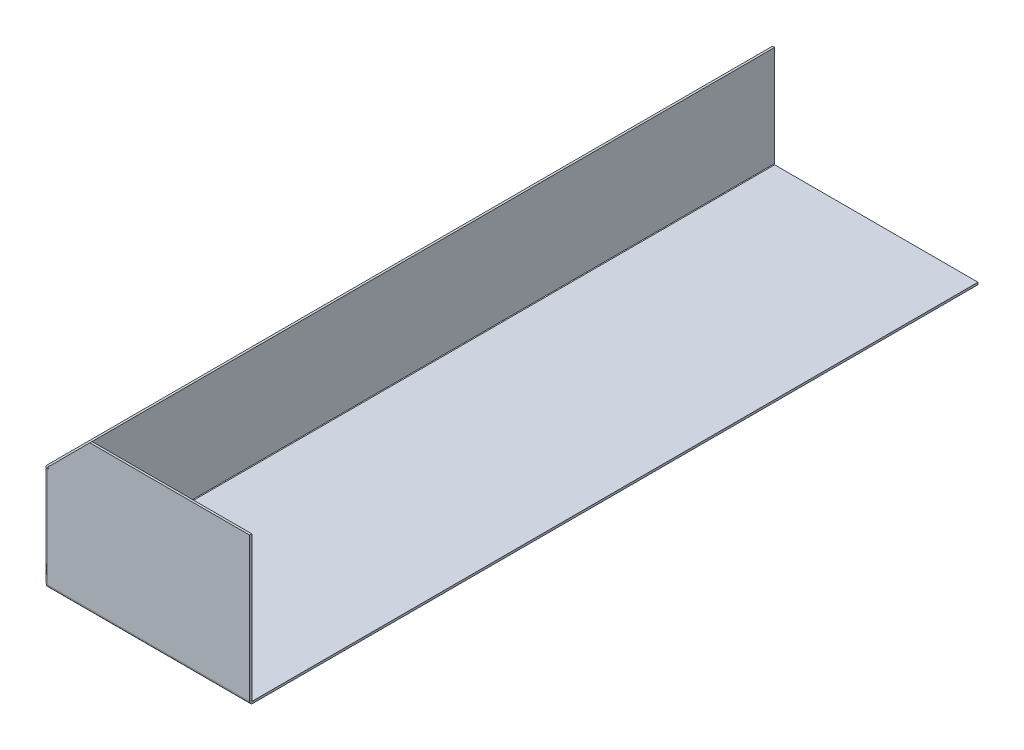
ISO-10303-21;
HEADER;
FILE_DESCRIPTION(('STEP AP214'),'2;1');
FILE_NAME('part.step','',(''),(''),'','','');
FILE_SCHEMA(('AUTOMOTIVE_DESIGN { 1 0 10303 214 1 1 1 1 }'));
ENDSEC;
DATA;
#1=APPLICATION_CONTEXT('core data for automotive mechanical design processes');
#2=APPLICATION_PROTOCOL_DEFINITION('international standard','automotive_design',2000,#1);
#3=PRODUCT_CONTEXT('',#1,'mechanical');
#4=PRODUCT('Part','Part','',(#3));
#5=PRODUCT_RELATED_PRODUCT_CATEGORY('part','',(#4));
#6=PRODUCT_DEFINITION_FORMATION('','',#4);
#7=PRODUCT_DEFINITION_CONTEXT('part definition',#1,'design');
#8=PRODUCT_DEFINITION('design','',#6,#7);
#9=PRODUCT_DEFINITION_SHAPE('','',#8);
#10=(LENGTH_UNIT() NAMED_UNIT(*) SI_UNIT(.MILLI.,.METRE.));
#11=(NAMED_UNIT(*) PLANE_ANGLE_UNIT() SI_UNIT($,.RADIAN.));
#12=(NAMED_UNIT(*) SI_UNIT($,.STERADIAN.) SOLID_ANGLE_UNIT());
#13=UNCERTAINTY_MEASURE_WITH_UNIT(LENGTH_MEASURE(1.E-05),#10,'distance_accuracy_value','');
#14=(GEOMETRIC_REPRESENTATION_CONTEXT(3) GLOBAL_UNCERTAINTY_ASSIGNED_CONTEXT((#13)) GLOBAL_UNIT_ASSIGNED_CONTEXT((#10,
#11,#12)) REPRESENTATION_CONTEXT('',''));
#15=CARTESIAN_POINT('',(0.,0.,0.));
#16=DIRECTION('',(0.,0.,1.));
#17=DIRECTION('',(1.,0.,0.));
#18=AXIS2_PLACEMENT_3D('',#15,#16,#17);
#19=CARTESIAN_POINT('',(-69.2634,-49.2634,-1.5));
#20=DIRECTION('',(0.,1.,0.));
#21=DIRECTION('',(0.,0.,1.));
#22=AXIS2_PLACEMENT_3D('',#19,#20,#21);
#23=PLANE('',#22);
#24=DIRECTION('',(-1.,0.,0.));
#25=VECTOR('',#24,1.);
#26=CARTESIAN_POINT('',(-70.,-49.2634,0.));
#27=LINE('',#26,#25);
#28=CARTESIAN_POINT('',(-70.,-49.2634,0.));
#29=VERTEX_POINT('',#28);
#30=CARTESIAN_POINT('',(-69.2634,-49.2634,0.));
#31=VERTEX_POINT('',#30);
#32=EDGE_CURVE('E265',#29,#31,#27,.F.);
#33=ORIENTED_EDGE('',*,*,#32,.T.);
#34=CARTESIAN_POINT('',(-69.2634,-49.2634,-2.23660000000001));
#35=DIRECTION('',(0.,1.,0.));
#36=DIRECTION('',(0.,0.,1.));
#37=AXIS2_PLACEMENT_3D('',#34,#35,#36);
#38=CIRCLE('',#37,2.2366);
#39=CARTESIAN_POINT('',(-70.,-49.2634,-0.124776143708955));
#40=VERTEX_POINT('',#39);
#41=EDGE_CURVE('E200',#31,#40,#38,.F.);
#42=ORIENTED_EDGE('',*,*,#41,.T.);
#43=DIRECTION('',(0.,0.,1.));
#44=VECTOR('',#43,1.);
#45=CARTESIAN_POINT('',(-70.,-49.2634,-1.50000000000001));
#46=LINE('',#45,#44);
#47=EDGE_CURVE('E271',#40,#29,#46,.T.);
#48=ORIENTED_EDGE('',*,*,#47,.T.);
#49=EDGE_LOOP('',(#33,#42,#48));
#50=FACE_BOUND('',#49,.T.);
#51=ADVANCED_FACE('F37',(#50),#23,.T.);
#52=CARTESIAN_POINT('',(0.,0.,-1.5));
#53=DIRECTION('',(0.,0.,-1.));
#54=DIRECTION('',(-1.,0.,0.));
#55=AXIS2_PLACEMENT_3D('',#52,#53,#54);
#56=PLANE('',#55);
#57=DIRECTION('',(0.,-1.,0.));
#58=VECTOR('',#57,1.);
#59=CARTESIAN_POINT('',(-68.5134,20.75,-1.5));
#60=LINE('',#59,#58);
#61=CARTESIAN_POINT('',(-68.5134,20.75,-1.5));
#62=VERTEX_POINT('',#61);
#63=CARTESIAN_POINT('',(-68.5134,20.,-1.5));
#64=VERTEX_POINT('',#63);
#65=EDGE_CURVE('E221',#62,#64,#60,.T.);
#66=ORIENTED_EDGE('',*,*,#65,.F.);
#67=DIRECTION('',(1.,0.,0.));
#68=VECTOR('',#67,1.);
#69=CARTESIAN_POINT('',(-69.25,20.75,-1.5));
#70=LINE('',#69,#68);
#71=CARTESIAN_POINT('',(-69.25,20.75,-1.5));
#72=VERTEX_POINT('',#71);
#73=EDGE_CURVE('E216',#72,#62,#70,.T.);
#74=ORIENTED_EDGE('',*,*,#73,.F.);
#75=DIRECTION('',(-0.707106781186547,-0.707106781186547,0.));
#76=VECTOR('',#75,1.);
#77=CARTESIAN_POINT('',(-70.,20.,-1.5));
#78=LINE('',#77,#76);
#79=CARTESIAN_POINT('',(-40.,50.,-1.5));
#80=VERTEX_POINT('',#79);
#81=EDGE_CURVE('E294',#80,#72,#78,.T.);
#82=ORIENTED_EDGE('',*,*,#81,.F.);
#83=DIRECTION('',(-1.,0.,0.));
#84=VECTOR('',#83,1.);
#85=CARTESIAN_POINT('',(-40.,50.,-1.5));
#86=LINE('',#85,#84);
#87=CARTESIAN_POINT('',(70.,50.,-1.5));
#88=VERTEX_POINT('',#87);
#89=EDGE_CURVE('E290',#88,#80,#86,.T.);
#90=ORIENTED_EDGE('',*,*,#89,.F.);
#91=DIRECTION('',(0.,1.,0.));
#92=VECTOR('',#91,1.);
#93=CARTESIAN_POINT('',(70.,-50.,-1.5));
#94=LINE('',#93,#92);
#95=CARTESIAN_POINT('',(70.,-49.2634,-1.5));
#96=VERTEX_POINT('',#95);
#97=EDGE_CURVE('E288',#96,#88,#94,.T.);
#98=ORIENTED_EDGE('',*,*,#97,.F.);
#99=DIRECTION('',(-1.,0.,0.));
#100=VECTOR('',#99,1.);
#101=CARTESIAN_POINT('',(-70.,-49.2634,-1.50000000000001));
#102=LINE('',#101,#100);
#103=CARTESIAN_POINT('',(-69.2634,-49.2634,-1.50000000000001));
#104=VERTEX_POINT('',#103);
#105=EDGE_CURVE('E52',#104,#96,#102,.F.);
#106=ORIENTED_EDGE('',*,*,#105,.F.);
#107=DIRECTION('',(0.,1.,0.));
#108=VECTOR('',#107,1.);
#109=CARTESIAN_POINT('',(-69.2634,20.,-1.5));
#110=LINE('',#109,#108);
#111=CARTESIAN_POINT('',(-69.2634,20.,-1.5));
#112=VERTEX_POINT('',#111);
#113=EDGE_CURVE('E209',#112,#104,#110,.F.);
#114=ORIENTED_EDGE('',*,*,#113,.F.);
#115=DIRECTION('',(-1.,0.,0.));
#116=VECTOR('',#115,1.);
#117=CARTESIAN_POINT('',(-68.5134,20.,-1.5));
#118=LINE('',#117,#116);
#119=EDGE_CURVE('E225',#64,#112,#118,.T.);
#120=ORIENTED_EDGE('',*,*,#119,.F.);
#121=EDGE_LOOP('',(#66,#74,#82,#90,#98,#106,#114,#120));
#122=FACE_BOUND('',#121,.T.);
#123=ADVANCED_FACE('F328',(#122),#56,.T.);
#124=CARTESIAN_POINT('',(0.,0.,0.));
#125=DIRECTION('',(0.,0.,-1.));
#126=DIRECTION('',(-1.,0.,0.));
#127=AXIS2_PLACEMENT_3D('',#124,#125,#126);
#128=PLANE('',#127);
#129=DIRECTION('',(-1.,0.,0.));
#130=VECTOR('',#129,1.);
#131=CARTESIAN_POINT('',(0.,20.75,0.));
#132=LINE('',#131,#130);
#133=CARTESIAN_POINT('',(-68.5134,20.75,0.));
#134=VERTEX_POINT('',#133);
#135=CARTESIAN_POINT('',(-69.25,20.75,0.));
#136=VERTEX_POINT('',#135);
#137=EDGE_CURVE('E219',#134,#136,#132,.T.);
#138=ORIENTED_EDGE('',*,*,#137,.F.);
#139=DIRECTION('',(0.,1.,0.));
#140=VECTOR('',#139,1.);
#141=CARTESIAN_POINT('',(-68.5134,0.,0.));
#142=LINE('',#141,#140);
#143=CARTESIAN_POINT('',(-68.5134,20.,0.));
#144=VERTEX_POINT('',#143);
#145=EDGE_CURVE('E11',#144,#134,#142,.T.);
#146=ORIENTED_EDGE('',*,*,#145,.F.);
#147=DIRECTION('',(1.,0.,0.));
#148=VECTOR('',#147,1.);
#149=CARTESIAN_POINT('',(0.,20.,0.));
#150=LINE('',#149,#148);
#151=CARTESIAN_POINT('',(-69.2634,20.,0.));
#152=VERTEX_POINT('',#151);
#153=EDGE_CURVE('E45',#152,#144,#150,.T.);
#154=ORIENTED_EDGE('',*,*,#153,.F.);
#155=DIRECTION('',(0.,1.,0.));
#156=VECTOR('',#155,1.);
#157=CARTESIAN_POINT('',(-69.2634,20.,0.));
#158=LINE('',#157,#156);
#159=EDGE_CURVE('E195',#152,#31,#158,.F.);
#160=ORIENTED_EDGE('',*,*,#159,.T.);
#161=CARTESIAN_POINT('',(70.,-49.2634,0.));
#162=VERTEX_POINT('',#161);
#163=EDGE_CURVE('E268',#31,#162,#27,.F.);
#164=ORIENTED_EDGE('',*,*,#163,.T.);
#165=DIRECTION('',(0.,1.,0.));
#166=VECTOR('',#165,1.);
#167=CARTESIAN_POINT('',(70.,-50.,0.));
#168=LINE('',#167,#166);
#169=CARTESIAN_POINT('',(70.,50.,0.));
#170=VERTEX_POINT('',#169);
#171=EDGE_CURVE('E284',#162,#170,#168,.T.);
#172=ORIENTED_EDGE('',*,*,#171,.T.);
#173=DIRECTION('',(-1.,0.,0.));
#174=VECTOR('',#173,1.);
#175=CARTESIAN_POINT('',(-40.,50.,0.));
#176=LINE('',#175,#174);
#177=CARTESIAN_POINT('',(-40.,50.,0.));
#178=VERTEX_POINT('',#177);
#179=EDGE_CURVE('E299',#170,#178,#176,.T.);
#180=ORIENTED_EDGE('',*,*,#179,.T.);
#181=DIRECTION('',(-0.707106781186547,-0.707106781186547,0.));
#182=VECTOR('',#181,1.);
#183=CARTESIAN_POINT('',(-70.,20.,0.));
#184=LINE('',#183,#182);
#185=EDGE_CURVE('E291',#178,#136,#184,.T.);
#186=ORIENTED_EDGE('',*,*,#185,.T.);
#187=EDGE_LOOP('',(#138,#146,#154,#160,#164,#172,#180,#186));
#188=FACE_BOUND('',#187,.T.);
#189=ADVANCED_FACE('F319',(#188),#128,.F.);
#190=CARTESIAN_POINT('',(-70.,20.,-1.5));
#191=DIRECTION('',(-0.707106781186548,0.707106781186548,0.));
#192=DIRECTION('',(-0.707106781186548,-0.707106781186548,0.));
#193=AXIS2_PLACEMENT_3D('',#190,#191,#192);
#194=PLANE('',#193);
#195=ORIENTED_EDGE('',*,*,#81,.T.);
#196=DIRECTION('',(0.,0.,1.));
#197=VECTOR('',#196,1.);
#198=CARTESIAN_POINT('',(-69.25,20.75,-1.5));
#199=LINE('',#198,#197);
#200=EDGE_CURVE('E220',#72,#136,#199,.T.);
#201=ORIENTED_EDGE('',*,*,#200,.T.);
#202=ORIENTED_EDGE('',*,*,#185,.F.);
#203=DIRECTION('',(0.,0.,1.));
#204=VECTOR('',#203,1.);
#205=CARTESIAN_POINT('',(-40.,50.,-1.5));
#206=LINE('',#205,#204);
#207=EDGE_CURVE('E304',#80,#178,#206,.T.);
#208=ORIENTED_EDGE('',*,*,#207,.F.);
#209=EDGE_LOOP('',(#195,#201,#202,#208));
#210=FACE_BOUND('',#209,.T.);
#211=ADVANCED_FACE('F325',(#210),#194,.T.);
#212=CARTESIAN_POINT('',(70.,-50.,-1.5));
#213=DIRECTION('',(1.,0.,0.));
#214=DIRECTION('',(0.,0.,-1.));
#215=AXIS2_PLACEMENT_3D('',#212,#213,#214);
#216=PLANE('',#215);
#217=DIRECTION('',(0.,0.,1.));
#218=VECTOR('',#217,1.);
#219=CARTESIAN_POINT('',(69.9999999999999,-49.2634,-1.50000000000001));
#220=LINE('',#219,#218);
#221=EDGE_CURVE('E281',#96,#162,#220,.T.);
#222=ORIENTED_EDGE('',*,*,#221,.F.);
#223=ORIENTED_EDGE('',*,*,#97,.T.);
#224=DIRECTION('',(0.,0.,1.));
#225=VECTOR('',#224,1.);
#226=CARTESIAN_POINT('',(70.,50.,-1.5));
#227=LINE('',#226,#225);
#228=EDGE_CURVE('E297',#88,#170,#227,.T.);
#229=ORIENTED_EDGE('',*,*,#228,.T.);
#230=ORIENTED_EDGE('',*,*,#171,.F.);
#231=EDGE_LOOP('',(#222,#223,#229,#230));
#232=FACE_BOUND('',#231,.T.);
#233=ADVANCED_FACE('F39',(#232),#216,.T.);
#234=CARTESIAN_POINT('',(-40.,50.,-1.5));
#235=DIRECTION('',(0.,1.,0.));
#236=DIRECTION('',(0.,0.,1.));
#237=AXIS2_PLACEMENT_3D('',#234,#235,#236);
#238=PLANE('',#237);
#239=ORIENTED_EDGE('',*,*,#179,.F.);
#240=ORIENTED_EDGE('',*,*,#228,.F.);
#241=ORIENTED_EDGE('',*,*,#89,.T.);
#242=ORIENTED_EDGE('',*,*,#207,.T.);
#243=EDGE_LOOP('',(#239,#240,#241,#242));
#244=FACE_BOUND('',#243,.T.);
#245=ADVANCED_FACE('F332',(#244),#238,.T.);
#246=CARTESIAN_POINT('',(69.9999999999999,-49.2634,-2.2366));
#247=DIRECTION('',(1.,0.,0.));
#248=DIRECTION('',(0.,0.,-1.));
#249=AXIS2_PLACEMENT_3D('',#246,#247,#248);
#250=PLANE('',#249);
#251=DIRECTION('',(0.,-1.,0.));
#252=VECTOR('',#251,1.);
#253=CARTESIAN_POINT('',(70.,-50.,-2.2366));
#254=LINE('',#253,#252);
#255=CARTESIAN_POINT('',(69.9999999999999,-50.,-2.2366));
#256=VERTEX_POINT('',#255);
#257=CARTESIAN_POINT('',(69.9999999999999,-51.5,-2.2366));
#258=VERTEX_POINT('',#257);
#259=EDGE_CURVE('E234',#256,#258,#254,.T.);
#260=ORIENTED_EDGE('',*,*,#259,.F.);
#261=CARTESIAN_POINT('',(69.9999999999999,-49.2634,-2.2366));
#262=DIRECTION('',(-1.,0.,0.));
#263=DIRECTION('',(0.,0.,1.));
#264=AXIS2_PLACEMENT_3D('',#261,#262,#263);
#265=CIRCLE('',#264,0.736599999999997);
#266=EDGE_CURVE('E275',#96,#256,#265,.F.);
#267=ORIENTED_EDGE('',*,*,#266,.F.);
#268=ORIENTED_EDGE('',*,*,#221,.T.);
#269=CARTESIAN_POINT('',(69.9999999999999,-49.2634,-2.2366));
#270=DIRECTION('',(-1.,0.,0.));
#271=DIRECTION('',(0.,0.,1.));
#272=AXIS2_PLACEMENT_3D('',#269,#270,#271);
#273=CIRCLE('',#272,2.2366);
#274=EDGE_CURVE('E267',#162,#258,#273,.F.);
#275=ORIENTED_EDGE('',*,*,#274,.T.);
#276=EDGE_LOOP('',(#260,#267,#268,#275));
#277=FACE_BOUND('',#276,.T.);
#278=ADVANCED_FACE('F337',(#277),#250,.T.);
#279=CARTESIAN_POINT('',(-70.,-49.2634,-2.2366));
#280=DIRECTION('',(1.,0.,0.));
#281=DIRECTION('',(0.,0.,-1.));
#282=AXIS2_PLACEMENT_3D('',#279,#280,#281);
#283=PLANE('',#282);
#284=CARTESIAN_POINT('',(-70.,-49.2634,-2.2366));
#285=DIRECTION('',(-1.,0.,0.));
#286=DIRECTION('',(0.,0.,1.));
#287=AXIS2_PLACEMENT_3D('',#284,#285,#286);
#288=CIRCLE('',#287,0.736599999999997);
#289=CARTESIAN_POINT('',(-70.,-50.,-2.2366));
#290=VERTEX_POINT('',#289);
#291=CARTESIAN_POINT('',(-70.,-49.2634,-1.5));
#292=VERTEX_POINT('',#291);
#293=EDGE_CURVE('E264',#290,#292,#288,.T.);
#294=ORIENTED_EDGE('',*,*,#293,.F.);
#295=DIRECTION('',(0.,-1.,0.));
#296=VECTOR('',#295,1.);
#297=CARTESIAN_POINT('',(-70.,-50.,-2.23660000000001));
#298=LINE('',#297,#296);
#299=CARTESIAN_POINT('',(-70.,-51.5,-2.2366));
#300=VERTEX_POINT('',#299);
#301=EDGE_CURVE('E237',#290,#300,#298,.T.);
#302=ORIENTED_EDGE('',*,*,#301,.T.);
#303=CARTESIAN_POINT('',(-70.,-49.2634,-2.2366));
#304=DIRECTION('',(-1.,0.,0.));
#305=DIRECTION('',(0.,0.,1.));
#306=AXIS2_PLACEMENT_3D('',#303,#304,#305);
#307=CIRCLE('',#306,2.2366);
#308=EDGE_CURVE('E272',#300,#29,#307,.T.);
#309=ORIENTED_EDGE('',*,*,#308,.T.);
#310=ORIENTED_EDGE('',*,*,#47,.F.);
#311=EDGE_CURVE('E285',#292,#40,#46,.T.);
#312=ORIENTED_EDGE('',*,*,#311,.F.);
#313=EDGE_LOOP('',(#294,#302,#309,#310,#312));
#314=FACE_BOUND('',#313,.T.);
#315=ADVANCED_FACE('F361',(#314),#283,.F.);
#316=CARTESIAN_POINT('',(-70.,-49.2634,-2.2366));
#317=DIRECTION('',(-1.,0.,0.));
#318=DIRECTION('',(0.,-1.,0.));
#319=AXIS2_PLACEMENT_3D('',#316,#317,#318);
#320=CYLINDRICAL_SURFACE('',#319,2.2366);
#321=ORIENTED_EDGE('',*,*,#32,.F.);
#322=ORIENTED_EDGE('',*,*,#308,.F.);
#323=DIRECTION('',(1.,0.,0.));
#324=VECTOR('',#323,1.);
#325=CARTESIAN_POINT('',(0.,-51.5,-2.2366));
#326=LINE('',#325,#324);
#327=EDGE_CURVE('E240',#300,#258,#326,.T.);
#328=ORIENTED_EDGE('',*,*,#327,.T.);
#329=ORIENTED_EDGE('',*,*,#274,.F.);
#330=ORIENTED_EDGE('',*,*,#163,.F.);
#331=EDGE_LOOP('',(#321,#322,#328,#329,#330));
#332=FACE_BOUND('',#331,.T.);
#333=ADVANCED_FACE('F366',(#332),#320,.T.);
#334=CARTESIAN_POINT('',(-70.,-49.2634,-2.2366));
#335=DIRECTION('',(-1.,0.,0.));
#336=DIRECTION('',(0.,-1.,0.));
#337=AXIS2_PLACEMENT_3D('',#334,#335,#336);
#338=CYLINDRICAL_SURFACE('',#337,0.736599999999997);
#339=EDGE_CURVE('E277',#292,#104,#102,.F.);
#340=ORIENTED_EDGE('',*,*,#339,.T.);
#341=ORIENTED_EDGE('',*,*,#105,.T.);
#342=ORIENTED_EDGE('',*,*,#266,.T.);
#343=DIRECTION('',(-1.,0.,0.));
#344=VECTOR('',#343,1.);
#345=CARTESIAN_POINT('',(70.,-50.,-2.2366));
#346=LINE('',#345,#344);
#347=EDGE_CURVE('E235',#256,#290,#346,.T.);
#348=ORIENTED_EDGE('',*,*,#347,.T.);
#349=ORIENTED_EDGE('',*,*,#293,.T.);
#350=EDGE_LOOP('',(#340,#341,#342,#348,#349));
#351=FACE_BOUND('',#350,.T.);
#352=ADVANCED_FACE('F340',(#351),#338,.F.);
#353=CARTESIAN_POINT('',(-70.,-51.5000000000018,-501.5));
#354=DIRECTION('',(1.,0.,0.));
#355=DIRECTION('',(0.,0.,-1.));
#356=AXIS2_PLACEMENT_3D('',#353,#354,#355);
#357=PLANE('',#356);
#358=ORIENTED_EDGE('',*,*,#301,.F.);
#359=DIRECTION('',(0.,0.,-1.));
#360=VECTOR('',#359,1.);
#361=CARTESIAN_POINT('',(-70.,-50.0000000000017,-501.5));
#362=LINE('',#361,#360);
#363=CARTESIAN_POINT('',(-70.,-50.0000000000017,-501.5));
#364=VERTEX_POINT('',#363);
#365=EDGE_CURVE('E244',#290,#364,#362,.T.);
#366=ORIENTED_EDGE('',*,*,#365,.T.);
#367=DIRECTION('',(0.,1.,0.));
#368=VECTOR('',#367,1.);
#369=CARTESIAN_POINT('',(-70.,-51.5000000000018,-501.5));
#370=LINE('',#369,#368);
#371=CARTESIAN_POINT('',(-70.,-51.5000000000018,-501.5));
#372=VERTEX_POINT('',#371);
#373=EDGE_CURVE('E261',#372,#364,#370,.T.);
#374=ORIENTED_EDGE('',*,*,#373,.F.);
#375=DIRECTION('',(0.,0.,-1.));
#376=VECTOR('',#375,1.);
#377=CARTESIAN_POINT('',(-70.,-51.5000000000018,-501.5));
#378=LINE('',#377,#376);
#379=EDGE_CURVE('E245',#300,#372,#378,.T.);
#380=ORIENTED_EDGE('',*,*,#379,.F.);
#381=EDGE_LOOP('',(#358,#366,#374,#380));
#382=FACE_BOUND('',#381,.T.);
#383=ADVANCED_FACE('F358',(#382),#357,.F.);
#384=CARTESIAN_POINT('',(70.,-51.5,-1.49999999999999));
#385=DIRECTION('',(-1.,0.,0.));
#386=DIRECTION('',(0.,0.,1.));
#387=AXIS2_PLACEMENT_3D('',#384,#385,#386);
#388=PLANE('',#387);
#389=ORIENTED_EDGE('',*,*,#259,.T.);
#390=DIRECTION('',(0.,0.,1.));
#391=VECTOR('',#390,1.);
#392=CARTESIAN_POINT('',(70.,-51.5,-1.49999999999999));
#393=LINE('',#392,#391);
#394=CARTESIAN_POINT('',(70.,-51.5000000000018,-501.5));
#395=VERTEX_POINT('',#394);
#396=EDGE_CURVE('E250',#395,#258,#393,.T.);
#397=ORIENTED_EDGE('',*,*,#396,.F.);
#398=DIRECTION('',(0.,1.,0.));
#399=VECTOR('',#398,1.);
#400=CARTESIAN_POINT('',(70.,-51.5000000000018,-501.5));
#401=LINE('',#400,#399);
#402=CARTESIAN_POINT('',(70.,-50.0000000000017,-501.5));
#403=VERTEX_POINT('',#402);
#404=EDGE_CURVE('E253',#395,#403,#401,.T.);
#405=ORIENTED_EDGE('',*,*,#404,.T.);
#406=DIRECTION('',(0.,0.,1.));
#407=VECTOR('',#406,1.);
#408=CARTESIAN_POINT('',(70.,-50.,-1.5));
#409=LINE('',#408,#407);
#410=EDGE_CURVE('E248',#403,#256,#409,.T.);
#411=ORIENTED_EDGE('',*,*,#410,.T.);
#412=EDGE_LOOP('',(#389,#397,#405,#411));
#413=FACE_BOUND('',#412,.T.);
#414=ADVANCED_FACE('F348',(#413),#388,.F.);
#415=CARTESIAN_POINT('',(0.,-51.5,1.80097348386727E-13));
#416=DIRECTION('',(0.,1.,0.));
#417=DIRECTION('',(0.,0.,1.));
#418=AXIS2_PLACEMENT_3D('',#415,#416,#417);
#419=PLANE('',#418);
#420=ORIENTED_EDGE('',*,*,#327,.F.);
#421=ORIENTED_EDGE('',*,*,#379,.T.);
#422=DIRECTION('',(1.,0.,0.));
#423=VECTOR('',#422,1.);
#424=CARTESIAN_POINT('',(70.,-51.5000000000018,-501.5));
#425=LINE('',#424,#423);
#426=EDGE_CURVE('E247',#372,#395,#425,.T.);
#427=ORIENTED_EDGE('',*,*,#426,.T.);
#428=ORIENTED_EDGE('',*,*,#396,.T.);
#429=EDGE_LOOP('',(#420,#421,#427,#428));
#430=FACE_BOUND('',#429,.T.);
#431=ADVANCED_FACE('F363',(#430),#419,.F.);
#432=CARTESIAN_POINT('',(0.,-50.,1.74860126378462E-13));
#433=DIRECTION('',(0.,1.,0.));
#434=DIRECTION('',(0.,0.,1.));
#435=AXIS2_PLACEMENT_3D('',#432,#433,#434);
#436=PLANE('',#435);
#437=ORIENTED_EDGE('',*,*,#365,.F.);
#438=ORIENTED_EDGE('',*,*,#347,.F.);
#439=ORIENTED_EDGE('',*,*,#410,.F.);
#440=DIRECTION('',(1.,0.,0.));
#441=VECTOR('',#440,1.);
#442=CARTESIAN_POINT('',(70.,-50.0000000000017,-501.5));
#443=LINE('',#442,#441);
#444=EDGE_CURVE('E255',#364,#403,#443,.T.);
#445=ORIENTED_EDGE('',*,*,#444,.F.);
#446=EDGE_LOOP('',(#437,#438,#439,#445));
#447=FACE_BOUND('',#446,.T.);
#448=ADVANCED_FACE('F345',(#447),#436,.T.);
#449=CARTESIAN_POINT('',(70.,-51.5000000000018,-501.5));
#450=DIRECTION('',(0.,0.,1.));
#451=DIRECTION('',(0.,-1.,0.));
#452=AXIS2_PLACEMENT_3D('',#449,#450,#451);
#453=PLANE('',#452);
#454=ORIENTED_EDGE('',*,*,#444,.T.);
#455=ORIENTED_EDGE('',*,*,#404,.F.);
#456=ORIENTED_EDGE('',*,*,#426,.F.);
#457=ORIENTED_EDGE('',*,*,#373,.T.);
#458=EDGE_LOOP('',(#454,#455,#456,#457));
#459=FACE_BOUND('',#458,.T.);
#460=ADVANCED_FACE('F353',(#459),#453,.F.);
#461=CARTESIAN_POINT('',(-68.5134,20.75,-1.5));
#462=DIRECTION('',(-1.,0.,0.));
#463=DIRECTION('',(0.,0.,1.));
#464=AXIS2_PLACEMENT_3D('',#461,#462,#463);
#465=PLANE('',#464);
#466=DIRECTION('',(0.,0.,1.));
#467=VECTOR('',#466,1.);
#468=CARTESIAN_POINT('',(-68.5134,20.,-1.5));
#469=LINE('',#468,#467);
#470=EDGE_CURVE('E215',#64,#144,#469,.T.);
#471=ORIENTED_EDGE('',*,*,#470,.T.);
#472=ORIENTED_EDGE('',*,*,#145,.T.);
#473=DIRECTION('',(0.,0.,1.));
#474=VECTOR('',#473,1.);
#475=CARTESIAN_POINT('',(-68.5134,20.75,-1.5));
#476=LINE('',#475,#474);
#477=EDGE_CURVE('E224',#62,#134,#476,.T.);
#478=ORIENTED_EDGE('',*,*,#477,.F.);
#479=ORIENTED_EDGE('',*,*,#65,.T.);
#480=EDGE_LOOP('',(#471,#472,#478,#479));
#481=FACE_BOUND('',#480,.T.);
#482=ADVANCED_FACE('F315',(#481),#465,.T.);
#483=CARTESIAN_POINT('',(-68.5134,20.,-1.5));
#484=DIRECTION('',(0.,1.,0.));
#485=DIRECTION('',(0.,0.,1.));
#486=AXIS2_PLACEMENT_3D('',#483,#484,#485);
#487=PLANE('',#486);
#488=DIRECTION('',(0.,0.,1.));
#489=VECTOR('',#488,1.);
#490=CARTESIAN_POINT('',(-69.2634,20.,-1.5));
#491=LINE('',#490,#489);
#492=EDGE_CURVE('E203',#112,#152,#491,.T.);
#493=ORIENTED_EDGE('',*,*,#492,.T.);
#494=ORIENTED_EDGE('',*,*,#153,.T.);
#495=ORIENTED_EDGE('',*,*,#470,.F.);
#496=ORIENTED_EDGE('',*,*,#119,.T.);
#497=EDGE_LOOP('',(#493,#494,#495,#496));
#498=FACE_BOUND('',#497,.T.);
#499=ADVANCED_FACE('F309',(#498),#487,.T.);
#500=CARTESIAN_POINT('',(-69.25,20.75,-1.5));
#501=DIRECTION('',(0.,-1.,0.));
#502=DIRECTION('',(0.,0.,-1.));
#503=AXIS2_PLACEMENT_3D('',#500,#501,#502);
#504=PLANE('',#503);
#505=ORIENTED_EDGE('',*,*,#477,.T.);
#506=ORIENTED_EDGE('',*,*,#137,.T.);
#507=ORIENTED_EDGE('',*,*,#200,.F.);
#508=ORIENTED_EDGE('',*,*,#73,.T.);
#509=EDGE_LOOP('',(#505,#506,#507,#508));
#510=FACE_BOUND('',#509,.T.);
#511=ADVANCED_FACE('F322',(#510),#504,.T.);
#512=CARTESIAN_POINT('',(-69.2634,-49.2634,-2.23660000000001));
#513=DIRECTION('',(0.,-1.,0.));
#514=DIRECTION('',(0.,0.,-1.));
#515=AXIS2_PLACEMENT_3D('',#512,#513,#514);
#516=PLANE('',#515);
#517=ORIENTED_EDGE('',*,*,#339,.F.);
#518=ORIENTED_EDGE('',*,*,#311,.T.);
#519=CARTESIAN_POINT('',(-71.5,-49.2634,-2.2366));
#520=VERTEX_POINT('',#519);
#521=EDGE_CURVE('E198',#40,#520,#38,.F.);
#522=ORIENTED_EDGE('',*,*,#521,.T.);
#523=DIRECTION('',(-1.,0.,0.));
#524=VECTOR('',#523,1.);
#525=CARTESIAN_POINT('',(-70.,-49.2634,-2.23660000000001));
#526=LINE('',#525,#524);
#527=CARTESIAN_POINT('',(-70.,-49.2634,-2.23660000000001));
#528=VERTEX_POINT('',#527);
#529=EDGE_CURVE('E165',#528,#520,#526,.T.);
#530=ORIENTED_EDGE('',*,*,#529,.F.);
#531=CARTESIAN_POINT('',(-69.2634,-49.2634,-2.23660000000001));
#532=DIRECTION('',(0.,1.,0.));
#533=DIRECTION('',(0.,0.,1.));
#534=AXIS2_PLACEMENT_3D('',#531,#532,#533);
#535=CIRCLE('',#534,0.736600000000004);
#536=EDGE_CURVE('E206',#104,#528,#535,.F.);
#537=ORIENTED_EDGE('',*,*,#536,.F.);
#538=EDGE_LOOP('',(#517,#518,#522,#530,#537));
#539=FACE_BOUND('',#538,.T.);
#540=ADVANCED_FACE('F395',(#539),#516,.T.);
#541=CARTESIAN_POINT('',(-69.2634,20.,-2.23660000000001));
#542=DIRECTION('',(0.,-1.,0.));
#543=DIRECTION('',(0.,0.,-1.));
#544=AXIS2_PLACEMENT_3D('',#541,#542,#543);
#545=PLANE('',#544);
#546=CARTESIAN_POINT('',(-69.2634,20.,-2.23660000000001));
#547=DIRECTION('',(0.,1.,0.));
#548=DIRECTION('',(0.,0.,1.));
#549=AXIS2_PLACEMENT_3D('',#546,#547,#548);
#550=CIRCLE('',#549,0.736600000000004);
#551=CARTESIAN_POINT('',(-70.,20.,-2.23660000000001));
#552=VERTEX_POINT('',#551);
#553=EDGE_CURVE('E193',#552,#112,#550,.T.);
#554=ORIENTED_EDGE('',*,*,#553,.F.);
#555=DIRECTION('',(-1.,0.,0.));
#556=VECTOR('',#555,1.);
#557=CARTESIAN_POINT('',(-70.,20.,-2.23660000000001));
#558=LINE('',#557,#556);
#559=CARTESIAN_POINT('',(-71.5,20.,-2.2366));
#560=VERTEX_POINT('',#559);
#561=EDGE_CURVE('E379',#552,#560,#558,.T.);
#562=ORIENTED_EDGE('',*,*,#561,.T.);
#563=CARTESIAN_POINT('',(-69.2634,20.,-2.23660000000001));
#564=DIRECTION('',(0.,1.,0.));
#565=DIRECTION('',(0.,0.,1.));
#566=AXIS2_PLACEMENT_3D('',#563,#564,#565);
#567=CIRCLE('',#566,2.2366);
#568=EDGE_CURVE('E199',#560,#152,#567,.T.);
#569=ORIENTED_EDGE('',*,*,#568,.T.);
#570=ORIENTED_EDGE('',*,*,#492,.F.);
#571=EDGE_LOOP('',(#554,#562,#569,#570));
#572=FACE_BOUND('',#571,.T.);
#573=ADVANCED_FACE('F377',(#572),#545,.F.);
#574=CARTESIAN_POINT('',(-69.2634,20.,-2.23660000000001));
#575=DIRECTION('',(0.,1.,0.));
#576=DIRECTION('',(-1.,0.,0.));
#577=AXIS2_PLACEMENT_3D('',#574,#575,#576);
#578=CYLINDRICAL_SURFACE('',#577,2.2366);
#579=ORIENTED_EDGE('',*,*,#159,.F.);
#580=ORIENTED_EDGE('',*,*,#568,.F.);
#581=DIRECTION('',(0.,1.,0.));
#582=VECTOR('',#581,1.);
#583=CARTESIAN_POINT('',(-71.5,0.,-2.2366));
#584=LINE('',#583,#582);
#585=EDGE_CURVE('E189',#520,#560,#584,.T.);
#586=ORIENTED_EDGE('',*,*,#585,.F.);
#587=ORIENTED_EDGE('',*,*,#521,.F.);
#588=ORIENTED_EDGE('',*,*,#41,.F.);
#589=EDGE_LOOP('',(#579,#580,#586,#587,#588));
#590=FACE_BOUND('',#589,.T.);
#591=ADVANCED_FACE('F371',(#590),#578,.T.);
#592=CARTESIAN_POINT('',(-69.2634,20.,-2.23660000000001));
#593=DIRECTION('',(0.,1.,0.));
#594=DIRECTION('',(-1.,0.,0.));
#595=AXIS2_PLACEMENT_3D('',#592,#593,#594);
#596=CYLINDRICAL_SURFACE('',#595,0.736600000000004);
#597=ORIENTED_EDGE('',*,*,#113,.T.);
#598=ORIENTED_EDGE('',*,*,#536,.T.);
#599=DIRECTION('',(0.,1.,0.));
#600=VECTOR('',#599,1.);
#601=CARTESIAN_POINT('',(-70.,-49.2634,-2.23660000000001));
#602=LINE('',#601,#600);
#603=EDGE_CURVE('E382',#528,#552,#602,.T.);
#604=ORIENTED_EDGE('',*,*,#603,.T.);
#605=ORIENTED_EDGE('',*,*,#553,.T.);
#606=EDGE_LOOP('',(#597,#598,#604,#605));
#607=FACE_BOUND('',#606,.T.);
#608=ADVANCED_FACE('F391',(#607),#596,.F.);
#609=CARTESIAN_POINT('',(-71.5,20.,-1.49999999999999));
#610=DIRECTION('',(0.,1.,0.));
#611=DIRECTION('',(0.,0.,1.));
#612=AXIS2_PLACEMENT_3D('',#609,#610,#611);
#613=PLANE('',#612);
#614=DIRECTION('',(0.,0.,1.));
#615=VECTOR('',#614,1.);
#616=CARTESIAN_POINT('',(-71.5,20.,-1.49999999999999));
#617=LINE('',#616,#615);
#618=CARTESIAN_POINT('',(-71.5000000000018,20.,-501.5));
#619=VERTEX_POINT('',#618);
#620=EDGE_CURVE('E179',#619,#560,#617,.T.);
#621=ORIENTED_EDGE('',*,*,#620,.T.);
#622=ORIENTED_EDGE('',*,*,#561,.F.);
#623=DIRECTION('',(0.,0.,1.));
#624=VECTOR('',#623,1.);
#625=CARTESIAN_POINT('',(-70.,20.,-1.5));
#626=LINE('',#625,#624);
#627=CARTESIAN_POINT('',(-70.0000000000018,20.,-501.5));
#628=VERTEX_POINT('',#627);
#629=EDGE_CURVE('E170',#628,#552,#626,.T.);
#630=ORIENTED_EDGE('',*,*,#629,.F.);
#631=DIRECTION('',(1.,0.,0.));
#632=VECTOR('',#631,1.);
#633=CARTESIAN_POINT('',(-71.5000000000018,20.,-501.5));
#634=LINE('',#633,#632);
#635=EDGE_CURVE('E178',#619,#628,#634,.T.);
#636=ORIENTED_EDGE('',*,*,#635,.F.);
#637=EDGE_LOOP('',(#621,#622,#630,#636));
#638=FACE_BOUND('',#637,.T.);
#639=ADVANCED_FACE('F384',(#638),#613,.T.);
#640=CARTESIAN_POINT('',(-71.5000000000018,-49.2634,-501.5));
#641=DIRECTION('',(0.,-1.,0.));
#642=DIRECTION('',(0.,0.,-1.));
#643=AXIS2_PLACEMENT_3D('',#640,#641,#642);
#644=PLANE('',#643);
#645=DIRECTION('',(0.,0.,-1.));
#646=VECTOR('',#645,1.);
#647=CARTESIAN_POINT('',(-70.0000000000018,-49.2634,-501.5));
#648=LINE('',#647,#646);
#649=CARTESIAN_POINT('',(-70.0000000000018,-49.2634,-501.5));
#650=VERTEX_POINT('',#649);
#651=EDGE_CURVE('E187',#528,#650,#648,.T.);
#652=ORIENTED_EDGE('',*,*,#651,.F.);
#653=ORIENTED_EDGE('',*,*,#529,.T.);
#654=DIRECTION('',(0.,0.,-1.));
#655=VECTOR('',#654,1.);
#656=CARTESIAN_POINT('',(-71.5000000000018,-49.2634,-501.5));
#657=LINE('',#656,#655);
#658=CARTESIAN_POINT('',(-71.5000000000018,-49.2634,-501.5));
#659=VERTEX_POINT('',#658);
#660=EDGE_CURVE('E159',#520,#659,#657,.T.);
#661=ORIENTED_EDGE('',*,*,#660,.T.);
#662=DIRECTION('',(1.,0.,0.));
#663=VECTOR('',#662,1.);
#664=CARTESIAN_POINT('',(-71.5000000000018,-49.2634,-501.5));
#665=LINE('',#664,#663);
#666=EDGE_CURVE('E163',#659,#650,#665,.T.);
#667=ORIENTED_EDGE('',*,*,#666,.T.);
#668=EDGE_LOOP('',(#652,#653,#661,#667));
#669=FACE_BOUND('',#668,.T.);
#670=ADVANCED_FACE('F162',(#669),#644,.T.);
#671=CARTESIAN_POINT('',(-71.5,0.,2.50041398938112E-13));
#672=DIRECTION('',(-1.,0.,0.));
#673=DIRECTION('',(0.,0.,1.));
#674=AXIS2_PLACEMENT_3D('',#671,#672,#673);
#675=PLANE('',#674);
#676=ORIENTED_EDGE('',*,*,#660,.F.);
#677=ORIENTED_EDGE('',*,*,#585,.T.);
#678=ORIENTED_EDGE('',*,*,#620,.F.);
#679=DIRECTION('',(0.,1.,0.));
#680=VECTOR('',#679,1.);
#681=CARTESIAN_POINT('',(-71.5000000000018,20.,-501.5));
#682=LINE('',#681,#680);
#683=EDGE_CURVE('E169',#659,#619,#682,.T.);
#684=ORIENTED_EDGE('',*,*,#683,.F.);
#685=EDGE_LOOP('',(#676,#677,#678,#684));
#686=FACE_BOUND('',#685,.T.);
#687=ADVANCED_FACE('F181',(#686),#675,.T.);
#688=CARTESIAN_POINT('',(-70.,0.,2.44804176929847E-13));
#689=DIRECTION('',(-1.,0.,0.));
#690=DIRECTION('',(0.,0.,1.));
#691=AXIS2_PLACEMENT_3D('',#688,#689,#690);
#692=PLANE('',#691);
#693=ORIENTED_EDGE('',*,*,#603,.F.);
#694=ORIENTED_EDGE('',*,*,#651,.T.);
#695=DIRECTION('',(0.,1.,0.));
#696=VECTOR('',#695,1.);
#697=CARTESIAN_POINT('',(-70.0000000000018,20.,-501.5));
#698=LINE('',#697,#696);
#699=EDGE_CURVE('E177',#650,#628,#698,.T.);
#700=ORIENTED_EDGE('',*,*,#699,.T.);
#701=ORIENTED_EDGE('',*,*,#629,.T.);
#702=EDGE_LOOP('',(#693,#694,#700,#701));
#703=FACE_BOUND('',#702,.T.);
#704=ADVANCED_FACE('F387',(#703),#692,.F.);
#705=CARTESIAN_POINT('',(-71.5000000000018,20.,-501.5));
#706=DIRECTION('',(0.,0.,-1.));
#707=DIRECTION('',(-1.,0.,0.));
#708=AXIS2_PLACEMENT_3D('',#705,#706,#707);
#709=PLANE('',#708);
#710=ORIENTED_EDGE('',*,*,#699,.F.);
#711=ORIENTED_EDGE('',*,*,#666,.F.);
#712=ORIENTED_EDGE('',*,*,#683,.T.);
#713=ORIENTED_EDGE('',*,*,#635,.T.);
#714=EDGE_LOOP('',(#710,#711,#712,#713));
#715=FACE_BOUND('',#714,.T.);
#716=ADVANCED_FACE('F174',(#715),#709,.T.);
#717=CLOSED_SHELL('',(#51,#123,#189,#211,#233,#245,#278,#315,#333,#352,#383,#414,#431,#448,#460,
#482,#499,#511,#540,#573,#591,#608,#639,#670,#687,#704,#716));
#718=MANIFOLD_SOLID_BREP('B2',#717);
#719=ADVANCED_BREP_SHAPE_REPRESENTATION('',(#18,#718),#14);
#720=SHAPE_DEFINITION_REPRESENTATION(#9,#719);
ENDSEC;
END-ISO-10303-21;
